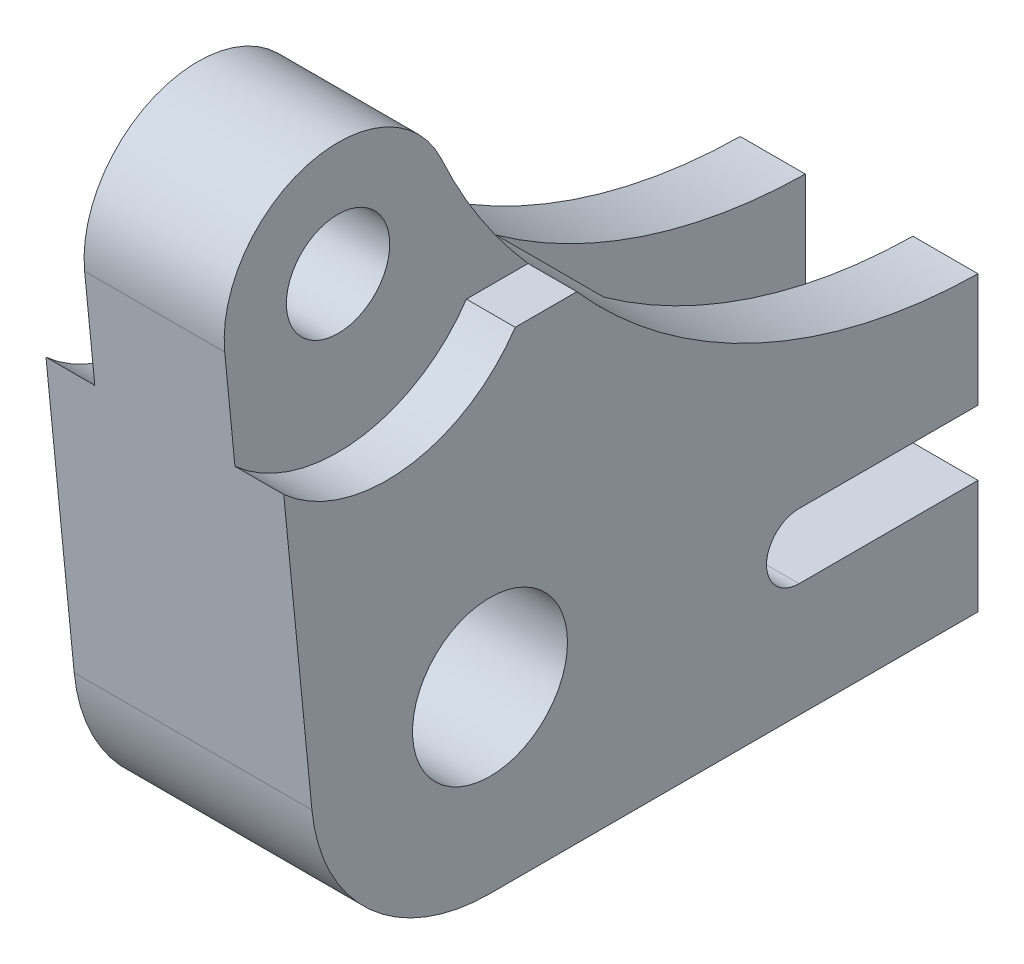
ISO-10303-21;
HEADER;
FILE_DESCRIPTION(('STEP AP214'),'2;1');
FILE_NAME('part.step','',(''),(''),'','','');
FILE_SCHEMA(('AUTOMOTIVE_DESIGN { 1 0 10303 214 1 1 1 1 }'));
ENDSEC;
DATA;
#1=APPLICATION_CONTEXT('core data for automotive mechanical design processes');
#2=APPLICATION_PROTOCOL_DEFINITION('international standard','automotive_design',2000,#1);
#3=PRODUCT_CONTEXT('',#1,'mechanical');
#4=PRODUCT('Part','Part','',(#3));
#5=PRODUCT_RELATED_PRODUCT_CATEGORY('part','',(#4));
#6=PRODUCT_DEFINITION_FORMATION('','',#4);
#7=PRODUCT_DEFINITION_CONTEXT('part definition',#1,'design');
#8=PRODUCT_DEFINITION('design','',#6,#7);
#9=PRODUCT_DEFINITION_SHAPE('','',#8);
#10=(LENGTH_UNIT() NAMED_UNIT(*) SI_UNIT(.MILLI.,.METRE.));
#11=(NAMED_UNIT(*) PLANE_ANGLE_UNIT() SI_UNIT($,.RADIAN.));
#12=(NAMED_UNIT(*) SI_UNIT($,.STERADIAN.) SOLID_ANGLE_UNIT());
#13=UNCERTAINTY_MEASURE_WITH_UNIT(LENGTH_MEASURE(1.E-05),#10,'distance_accuracy_value','');
#14=(GEOMETRIC_REPRESENTATION_CONTEXT(3) GLOBAL_UNCERTAINTY_ASSIGNED_CONTEXT((#13)) GLOBAL_UNIT_ASSIGNED_CONTEXT((#10,
#11,#12)) REPRESENTATION_CONTEXT('',''));
#15=CARTESIAN_POINT('',(0.,0.,0.));
#16=DIRECTION('',(0.,0.,1.));
#17=DIRECTION('',(1.,0.,0.));
#18=AXIS2_PLACEMENT_3D('',#15,#16,#17);
#19=CARTESIAN_POINT('',(14.615,47.3303654881643,12.6821332100236));
#20=DIRECTION('',(-1.,0.,0.));
#21=DIRECTION('',(0.,0.,1.));
#22=AXIS2_PLACEMENT_3D('',#19,#20,#21);
#23=CYLINDRICAL_SURFACE('',#22,14.);
#24=CARTESIAN_POINT('',(-8.615,47.3303654881643,12.6821332100236));
#25=DIRECTION('',(1.,0.,0.));
#26=DIRECTION('',(0.,0.,-1.));
#27=AXIS2_PLACEMENT_3D('',#24,#25,#26);
#28=CIRCLE('',#27,14.);
#29=CARTESIAN_POINT('',(-8.615,53.2602472106962,0.));
#30=VERTEX_POINT('',#29);
#31=CARTESIAN_POINT('',(-8.615,45.9633482628683,26.6152327900073));
#32=VERTEX_POINT('',#31);
#33=EDGE_CURVE('E222',#30,#32,#28,.T.);
#34=ORIENTED_EDGE('',*,*,#33,.T.);
#35=DIRECTION('',(-1.,0.,0.));
#36=VECTOR('',#35,1.);
#37=CARTESIAN_POINT('',(14.615,45.9633482628683,26.6152327900073));
#38=LINE('',#37,#36);
#39=CARTESIAN_POINT('',(8.615,45.9633482628683,26.6152327900073));
#40=VERTEX_POINT('',#39);
#41=EDGE_CURVE('E438',#40,#32,#38,.T.);
#42=ORIENTED_EDGE('',*,*,#41,.F.);
#43=CARTESIAN_POINT('',(8.615,47.3303654881643,12.6821332100236));
#44=DIRECTION('',(1.,0.,0.));
#45=DIRECTION('',(0.,0.,-1.));
#46=AXIS2_PLACEMENT_3D('',#43,#44,#45);
#47=CIRCLE('',#46,14.);
#48=CARTESIAN_POINT('',(8.615,53.2602472106962,0.));
#49=VERTEX_POINT('',#48);
#50=EDGE_CURVE('E70',#49,#40,#47,.T.);
#51=ORIENTED_EDGE('',*,*,#50,.F.);
#52=DIRECTION('',(-1.,0.,0.));
#53=VECTOR('',#52,1.);
#54=CARTESIAN_POINT('',(14.615,53.2602472106962,0.));
#55=LINE('',#54,#53);
#56=EDGE_CURVE('E442',#49,#30,#55,.T.);
#57=ORIENTED_EDGE('',*,*,#56,.T.);
#58=EDGE_LOOP('',(#34,#42,#51,#57));
#59=FACE_BOUND('',#58,.T.);
#60=ADVANCED_FACE('F45',(#59),#23,.T.);
#61=CARTESIAN_POINT('',(14.615,47.3303654881643,12.6821332100236));
#62=DIRECTION('',(-1.,0.,0.));
#63=DIRECTION('',(0.,0.,1.));
#64=AXIS2_PLACEMENT_3D('',#61,#62,#63);
#65=CYLINDRICAL_SURFACE('',#64,6.35);
#66=CARTESIAN_POINT('',(8.615,47.3303654881643,12.6821332100236));
#67=DIRECTION('',(1.,0.,0.));
#68=DIRECTION('',(0.,0.,-1.));
#69=AXIS2_PLACEMENT_3D('',#66,#67,#68);
#70=CIRCLE('',#69,6.35);
#71=CARTESIAN_POINT('',(8.615,47.3303654881643,6.33213321002356));
#72=VERTEX_POINT('',#71);
#73=EDGE_CURVE('E49',#72,#72,#70,.T.);
#74=ORIENTED_EDGE('',*,*,#73,.T.);
#75=EDGE_LOOP('',(#74));
#76=FACE_BOUND('',#75,.T.);
#77=CARTESIAN_POINT('',(-8.615,47.3303654881643,12.6821332100236));
#78=DIRECTION('',(-1.,0.,0.));
#79=DIRECTION('',(0.,0.,1.));
#80=AXIS2_PLACEMENT_3D('',#77,#78,#79);
#81=CIRCLE('',#80,6.35);
#82=CARTESIAN_POINT('',(-8.615,47.3303654881643,19.0321332100236));
#83=VERTEX_POINT('',#82);
#84=EDGE_CURVE('E242',#83,#83,#81,.T.);
#85=ORIENTED_EDGE('',*,*,#84,.T.);
#86=EDGE_LOOP('',(#85));
#87=FACE_BOUND('',#86,.T.);
#88=ADVANCED_FACE('F567',(#76,#87),#65,.F.);
#89=CARTESIAN_POINT('',(-14.615,80.9926693409927,-60.9910875684886));
#90=DIRECTION('',(-1.,0.,0.));
#91=DIRECTION('',(0.,0.,1.));
#92=AXIS2_PLACEMENT_3D('',#89,#90,#91);
#93=PLANE('',#92);
#94=CARTESIAN_POINT('',(-14.615,0.,0.));
#95=DIRECTION('',(1.,0.,0.));
#96=DIRECTION('',(0.,0.,-1.));
#97=AXIS2_PLACEMENT_3D('',#94,#95,#96);
#98=CIRCLE('',#97,9.525);
#99=CARTESIAN_POINT('',(-14.615,0.,-9.525));
#100=VERTEX_POINT('',#99);
#101=EDGE_CURVE('E362',#100,#100,#98,.T.);
#102=ORIENTED_EDGE('',*,*,#101,.T.);
#103=EDGE_LOOP('',(#102));
#104=FACE_BOUND('',#103,.T.);
#105=DIRECTION('',(0.,-0.995221398570269,-0.0976440875211449));
#106=VECTOR('',#105,1.);
#107=CARTESIAN_POINT('',(-14.615,45.9633482628683,26.6152327900073));
#108=LINE('',#107,#106);
#109=CARTESIAN_POINT('',(-14.615,33.1794979309688,25.3609717758667));
#110=VERTEX_POINT('',#109);
#111=CARTESIAN_POINT('',(-14.615,-2.14816992546519,21.8948707685459));
#112=VERTEX_POINT('',#111);
#113=EDGE_CURVE('E407',#110,#112,#108,.T.);
#114=ORIENTED_EDGE('',*,*,#113,.F.);
#115=CARTESIAN_POINT('',(-14.615,47.3303654881643,12.6821332100236));
#116=DIRECTION('',(1.,0.,0.));
#117=DIRECTION('',(0.,0.,-1.));
#118=AXIS2_PLACEMENT_3D('',#115,#116,#117);
#119=CIRCLE('',#118,19.);
#120=CARTESIAN_POINT('',(-14.615,36.7503654881643,-3.09961574248484));
#121=VERTEX_POINT('',#120);
#122=EDGE_CURVE('E227',#110,#121,#119,.T.);
#123=ORIENTED_EDGE('',*,*,#122,.T.);
#124=DIRECTION('',(0.,0.,-1.));
#125=VECTOR('',#124,1.);
#126=CARTESIAN_POINT('',(-14.615,36.7503654881643,-3.09961574248484));
#127=LINE('',#126,#125);
#128=CARTESIAN_POINT('',(-14.615,36.7503654881643,-10.675895530755));
#129=VERTEX_POINT('',#128);
#130=EDGE_CURVE('E474',#121,#129,#127,.T.);
#131=ORIENTED_EDGE('',*,*,#130,.T.);
#132=CARTESIAN_POINT('',(-14.615,80.9926693409927,-60.9910875684886));
#133=DIRECTION('',(-1.,0.,0.));
#134=DIRECTION('',(0.,0.,1.));
#135=AXIS2_PLACEMENT_3D('',#132,#133,#134);
#136=CIRCLE('',#135,67.);
#137=CARTESIAN_POINT('',(-14.615,14.,-60.));
#138=VERTEX_POINT('',#137);
#139=EDGE_CURVE('E231',#138,#129,#136,.T.);
#140=ORIENTED_EDGE('',*,*,#139,.F.);
#141=DIRECTION('',(0.,1.,0.));
#142=VECTOR('',#141,1.);
#143=CARTESIAN_POINT('',(-14.615,-22.,-60.));
#144=LINE('',#143,#142);
#145=CARTESIAN_POINT('',(-14.615,0.,-60.));
#146=VERTEX_POINT('',#145);
#147=EDGE_CURVE('E417',#146,#138,#144,.T.);
#148=ORIENTED_EDGE('',*,*,#147,.F.);
#149=DIRECTION('',(0.,0.,1.));
#150=VECTOR('',#149,1.);
#151=CARTESIAN_POINT('',(-14.615,0.,-38.));
#152=LINE('',#151,#150);
#153=CARTESIAN_POINT('',(-14.615,0.,-38.));
#154=VERTEX_POINT('',#153);
#155=EDGE_CURVE('E343',#146,#154,#152,.T.);
#156=ORIENTED_EDGE('',*,*,#155,.T.);
#157=CARTESIAN_POINT('',(-14.615,-4.,-38.));
#158=DIRECTION('',(1.,0.,0.));
#159=DIRECTION('',(0.,0.,-1.));
#160=AXIS2_PLACEMENT_3D('',#157,#158,#159);
#161=CIRCLE('',#160,4.);
#162=CARTESIAN_POINT('',(-14.615,-8.,-38.));
#163=VERTEX_POINT('',#162);
#164=EDGE_CURVE('E334',#154,#163,#161,.T.);
#165=ORIENTED_EDGE('',*,*,#164,.T.);
#166=DIRECTION('',(0.,0.,-1.));
#167=VECTOR('',#166,1.);
#168=CARTESIAN_POINT('',(-14.615,-8.,-38.));
#169=LINE('',#168,#167);
#170=CARTESIAN_POINT('',(-14.615,-8.,-60.));
#171=VERTEX_POINT('',#170);
#172=EDGE_CURVE('E338',#163,#171,#169,.T.);
#173=ORIENTED_EDGE('',*,*,#172,.T.);
#174=CARTESIAN_POINT('',(-14.615,-22.,-60.));
#175=VERTEX_POINT('',#174);
#176=EDGE_CURVE('E390',#175,#171,#144,.T.);
#177=ORIENTED_EDGE('',*,*,#176,.F.);
#178=DIRECTION('',(0.,0.,-1.));
#179=VECTOR('',#178,1.);
#180=CARTESIAN_POINT('',(-14.615,-22.,0.));
#181=LINE('',#180,#179);
#182=CARTESIAN_POINT('',(-14.615,-22.,0.));
#183=VERTEX_POINT('',#182);
#184=EDGE_CURVE('E413',#183,#175,#181,.T.);
#185=ORIENTED_EDGE('',*,*,#184,.F.);
#186=CARTESIAN_POINT('',(-14.615,0.,0.));
#187=DIRECTION('',(1.,0.,0.));
#188=DIRECTION('',(0.,0.,-1.));
#189=AXIS2_PLACEMENT_3D('',#186,#187,#188);
#190=CIRCLE('',#189,22.);
#191=EDGE_CURVE('E410',#112,#183,#190,.T.);
#192=ORIENTED_EDGE('',*,*,#191,.F.);
#193=EDGE_LOOP('',(#114,#123,#131,#140,#148,#156,#165,#173,#177,#185,#192));
#194=FACE_BOUND('',#193,.T.);
#195=ADVANCED_FACE('F543',(#104,#194),#93,.T.);
#196=CARTESIAN_POINT('',(14.615,80.9926693409927,-60.9910875684886));
#197=DIRECTION('',(-1.,0.,0.));
#198=DIRECTION('',(0.,0.,1.));
#199=AXIS2_PLACEMENT_3D('',#196,#197,#198);
#200=CYLINDRICAL_SURFACE('',#199,67.);
#201=DIRECTION('',(-1.,0.,0.));
#202=VECTOR('',#201,1.);
#203=CARTESIAN_POINT('',(-8.615,36.7503654881643,-10.675895530755));
#204=LINE('',#203,#202);
#205=CARTESIAN_POINT('',(-8.615,36.7503654881643,-10.675895530755));
#206=VERTEX_POINT('',#205);
#207=EDGE_CURVE('E213',#206,#129,#204,.T.);
#208=ORIENTED_EDGE('',*,*,#207,.F.);
#209=CARTESIAN_POINT('',(-8.615,80.9926693409927,-60.9910875684886));
#210=DIRECTION('',(-1.,0.,0.));
#211=DIRECTION('',(0.,0.,-1.));
#212=AXIS2_PLACEMENT_3D('',#209,#210,#211);
#213=CIRCLE('',#212,67.);
#214=EDGE_CURVE('E217',#206,#30,#213,.T.);
#215=ORIENTED_EDGE('',*,*,#214,.T.);
#216=ORIENTED_EDGE('',*,*,#56,.F.);
#217=CARTESIAN_POINT('',(8.615,80.9926693409927,-60.9910875684886));
#218=DIRECTION('',(-1.,0.,0.));
#219=DIRECTION('',(0.,0.,-1.));
#220=AXIS2_PLACEMENT_3D('',#217,#218,#219);
#221=CIRCLE('',#220,67.);
#222=CARTESIAN_POINT('',(8.615,36.7503654881643,-10.675895530755));
#223=VERTEX_POINT('',#222);
#224=EDGE_CURVE('E247',#223,#49,#221,.T.);
#225=ORIENTED_EDGE('',*,*,#224,.F.);
#226=DIRECTION('',(1.,0.,0.));
#227=VECTOR('',#226,1.);
#228=CARTESIAN_POINT('',(8.615,36.7503654881643,-10.675895530755));
#229=LINE('',#228,#227);
#230=CARTESIAN_POINT('',(14.615,36.7503654881643,-10.675895530755));
#231=VERTEX_POINT('',#230);
#232=EDGE_CURVE('E270',#223,#231,#229,.T.);
#233=ORIENTED_EDGE('',*,*,#232,.T.);
#234=CARTESIAN_POINT('',(14.615,80.9926693409927,-60.9910875684886));
#235=DIRECTION('',(-1.,0.,0.));
#236=DIRECTION('',(0.,0.,1.));
#237=AXIS2_PLACEMENT_3D('',#234,#235,#236);
#238=CIRCLE('',#237,67.);
#239=CARTESIAN_POINT('',(14.615,14.,-60.));
#240=VERTEX_POINT('',#239);
#241=EDGE_CURVE('E385',#240,#231,#238,.T.);
#242=ORIENTED_EDGE('',*,*,#241,.F.);
#243=DIRECTION('',(-1.,0.,0.));
#244=VECTOR('',#243,1.);
#245=CARTESIAN_POINT('',(14.615,14.,-60.));
#246=LINE('',#245,#244);
#247=CARTESIAN_POINT('',(6.61500000000001,14.,-60.));
#248=VERTEX_POINT('',#247);
#249=EDGE_CURVE('E421',#240,#248,#246,.T.);
#250=ORIENTED_EDGE('',*,*,#249,.T.);
#251=CARTESIAN_POINT('',(6.61500000000001,80.9926693409927,-60.9910875684886));
#252=DIRECTION('',(1.,0.,0.));
#253=DIRECTION('',(0.,0.,-1.));
#254=AXIS2_PLACEMENT_3D('',#251,#252,#253);
#255=CIRCLE('',#254,67.);
#256=CARTESIAN_POINT('',(6.615,26.5069364357041,-22.));
#257=VERTEX_POINT('',#256);
#258=EDGE_CURVE('E313',#248,#257,#255,.F.);
#259=ORIENTED_EDGE('',*,*,#258,.T.);
#260=DIRECTION('',(-1.,0.,0.));
#261=VECTOR('',#260,1.);
#262=CARTESIAN_POINT('',(14.615,26.5069364357041,-22.));
#263=LINE('',#262,#261);
#264=CARTESIAN_POINT('',(-6.61499999999999,26.5069364357041,-22.));
#265=VERTEX_POINT('',#264);
#266=EDGE_CURVE('E329',#257,#265,#263,.T.);
#267=ORIENTED_EDGE('',*,*,#266,.T.);
#268=CARTESIAN_POINT('',(-6.61499999999999,80.9926693409927,-60.9910875684886));
#269=DIRECTION('',(-1.,0.,0.));
#270=DIRECTION('',(0.,0.,1.));
#271=AXIS2_PLACEMENT_3D('',#268,#269,#270);
#272=CIRCLE('',#271,67.);
#273=CARTESIAN_POINT('',(-6.61499999999999,14.,-60.));
#274=VERTEX_POINT('',#273);
#275=EDGE_CURVE('E325',#265,#274,#272,.F.);
#276=ORIENTED_EDGE('',*,*,#275,.T.);
#277=EDGE_CURVE('E404',#274,#138,#246,.T.);
#278=ORIENTED_EDGE('',*,*,#277,.T.);
#279=ORIENTED_EDGE('',*,*,#139,.T.);
#280=EDGE_LOOP('',(#208,#215,#216,#225,#233,#242,#250,#259,#267,#276,#278,#279));
#281=FACE_BOUND('',#280,.T.);
#282=ADVANCED_FACE('F47',(#281),#200,.F.);
#283=CARTESIAN_POINT('',(14.615,45.9633482628683,26.6152327900073));
#284=DIRECTION('',(0.,0.0976440875211449,-0.995221398570269));
#285=DIRECTION('',(0.,0.995221398570269,0.097644087521145));
#286=AXIS2_PLACEMENT_3D('',#283,#284,#285);
#287=PLANE('',#286);
#288=DIRECTION('',(-1.,0.,0.));
#289=VECTOR('',#288,1.);
#290=CARTESIAN_POINT('',(-8.615,33.1794979309688,25.3609717758667));
#291=LINE('',#290,#289);
#292=CARTESIAN_POINT('',(-8.615,33.1794979309688,25.3609717758667));
#293=VERTEX_POINT('',#292);
#294=EDGE_CURVE('E236',#293,#110,#291,.T.);
#295=ORIENTED_EDGE('',*,*,#294,.T.);
#296=ORIENTED_EDGE('',*,*,#113,.T.);
#297=DIRECTION('',(-1.,0.,0.));
#298=VECTOR('',#297,1.);
#299=CARTESIAN_POINT('',(14.615,-2.14816992546519,21.8948707685459));
#300=LINE('',#299,#298);
#301=CARTESIAN_POINT('',(14.615,-2.14816992546519,21.8948707685459));
#302=VERTEX_POINT('',#301);
#303=EDGE_CURVE('E434',#302,#112,#300,.T.);
#304=ORIENTED_EDGE('',*,*,#303,.F.);
#305=DIRECTION('',(0.,-0.995221398570269,-0.0976440875211449));
#306=VECTOR('',#305,1.);
#307=CARTESIAN_POINT('',(14.615,45.9633482628683,26.6152327900073));
#308=LINE('',#307,#306);
#309=CARTESIAN_POINT('',(14.615,33.1794979309688,25.3609717758667));
#310=VERTEX_POINT('',#309);
#311=EDGE_CURVE('E389',#310,#302,#308,.T.);
#312=ORIENTED_EDGE('',*,*,#311,.F.);
#313=DIRECTION('',(1.,0.,0.));
#314=VECTOR('',#313,1.);
#315=CARTESIAN_POINT('',(8.615,33.1794979309688,25.3609717758667));
#316=LINE('',#315,#314);
#317=CARTESIAN_POINT('',(8.615,33.1794979309688,25.3609717758667));
#318=VERTEX_POINT('',#317);
#319=EDGE_CURVE('E264',#318,#310,#316,.T.);
#320=ORIENTED_EDGE('',*,*,#319,.F.);
#321=DIRECTION('',(0.,-0.995221398570269,-0.0976440875211446));
#322=VECTOR('',#321,1.);
#323=CARTESIAN_POINT('',(8.615,45.9633482628683,26.6152327900073));
#324=LINE('',#323,#322);
#325=EDGE_CURVE('E253',#40,#318,#324,.T.);
#326=ORIENTED_EDGE('',*,*,#325,.F.);
#327=ORIENTED_EDGE('',*,*,#41,.T.);
#328=DIRECTION('',(0.,-0.995221398570269,-0.0976440875211446));
#329=VECTOR('',#328,1.);
#330=CARTESIAN_POINT('',(-8.615,45.9633482628683,26.6152327900073));
#331=LINE('',#330,#329);
#332=EDGE_CURVE('E238',#32,#293,#331,.T.);
#333=ORIENTED_EDGE('',*,*,#332,.T.);
#334=EDGE_LOOP('',(#295,#296,#304,#312,#320,#326,#327,#333));
#335=FACE_BOUND('',#334,.T.);
#336=ADVANCED_FACE('F482',(#335),#287,.F.);
#337=CARTESIAN_POINT('',(14.615,-22.,-60.));
#338=DIRECTION('',(0.,0.,1.));
#339=DIRECTION('',(0.,-1.,0.));
#340=AXIS2_PLACEMENT_3D('',#337,#338,#339);
#341=PLANE('',#340);
#342=ORIENTED_EDGE('',*,*,#277,.F.);
#343=DIRECTION('',(0.,-1.,0.));
#344=VECTOR('',#343,1.);
#345=CARTESIAN_POINT('',(-6.61499999999999,61.3303654881643,-60.));
#346=LINE('',#345,#344);
#347=CARTESIAN_POINT('',(-6.61499999999999,0.,-60.));
#348=VERTEX_POINT('',#347);
#349=EDGE_CURVE('E302',#274,#348,#346,.T.);
#350=ORIENTED_EDGE('',*,*,#349,.T.);
#351=DIRECTION('',(1.,0.,0.));
#352=VECTOR('',#351,1.);
#353=CARTESIAN_POINT('',(-14.615,0.,-60.));
#354=LINE('',#353,#352);
#355=EDGE_CURVE('E364',#146,#348,#354,.T.);
#356=ORIENTED_EDGE('',*,*,#355,.F.);
#357=ORIENTED_EDGE('',*,*,#147,.T.);
#358=EDGE_LOOP('',(#342,#350,#356,#357));
#359=FACE_BOUND('',#358,.T.);
#360=ADVANCED_FACE('F530',(#359),#341,.F.);
#361=DIRECTION('',(1.,0.,0.));
#362=VECTOR('',#361,1.);
#363=CARTESIAN_POINT('',(-14.615,-8.,-60.));
#364=LINE('',#363,#362);
#365=CARTESIAN_POINT('',(-6.61499999999999,-7.99999999999997,-60.));
#366=VERTEX_POINT('',#365);
#367=EDGE_CURVE('E369',#171,#366,#364,.T.);
#368=ORIENTED_EDGE('',*,*,#367,.T.);
#369=CARTESIAN_POINT('',(-6.61499999999999,-22.,-60.));
#370=VERTEX_POINT('',#369);
#371=EDGE_CURVE('E290',#366,#370,#346,.T.);
#372=ORIENTED_EDGE('',*,*,#371,.T.);
#373=DIRECTION('',(-1.,0.,0.));
#374=VECTOR('',#373,1.);
#375=CARTESIAN_POINT('',(14.615,-22.,-60.));
#376=LINE('',#375,#374);
#377=EDGE_CURVE('E425',#370,#175,#376,.T.);
#378=ORIENTED_EDGE('',*,*,#377,.T.);
#379=ORIENTED_EDGE('',*,*,#176,.T.);
#380=EDGE_LOOP('',(#368,#372,#378,#379));
#381=FACE_BOUND('',#380,.T.);
#382=ADVANCED_FACE('F538',(#381),#341,.F.);
#383=CARTESIAN_POINT('',(-14.615,-4.,-38.));
#384=DIRECTION('',(1.,0.,0.));
#385=DIRECTION('',(0.,0.,-1.));
#386=AXIS2_PLACEMENT_3D('',#383,#384,#385);
#387=CYLINDRICAL_SURFACE('',#386,4.);
#388=DIRECTION('',(1.,0.,0.));
#389=VECTOR('',#388,1.);
#390=CARTESIAN_POINT('',(-14.615,0.,-38.));
#391=LINE('',#390,#389);
#392=CARTESIAN_POINT('',(-6.61499999999999,0.,-38.));
#393=VERTEX_POINT('',#392);
#394=EDGE_CURVE('E358',#154,#393,#391,.T.);
#395=ORIENTED_EDGE('',*,*,#394,.T.);
#396=CARTESIAN_POINT('',(-6.61499999999999,-4.,-38.));
#397=DIRECTION('',(-1.,0.,0.));
#398=DIRECTION('',(0.,0.,1.));
#399=AXIS2_PLACEMENT_3D('',#396,#397,#398);
#400=CIRCLE('',#399,4.);
#401=CARTESIAN_POINT('',(-6.61499999999999,-8.,-38.));
#402=VERTEX_POINT('',#401);
#403=EDGE_CURVE('E317',#393,#402,#400,.F.);
#404=ORIENTED_EDGE('',*,*,#403,.T.);
#405=DIRECTION('',(1.,0.,0.));
#406=VECTOR('',#405,1.);
#407=CARTESIAN_POINT('',(-14.615,-8.,-38.));
#408=LINE('',#407,#406);
#409=EDGE_CURVE('E374',#163,#402,#408,.T.);
#410=ORIENTED_EDGE('',*,*,#409,.F.);
#411=ORIENTED_EDGE('',*,*,#164,.F.);
#412=EDGE_LOOP('',(#395,#404,#410,#411));
#413=FACE_BOUND('',#412,.T.);
#414=ADVANCED_FACE('F550',(#413),#387,.F.);
#415=CARTESIAN_POINT('',(-14.615,0.,-38.));
#416=DIRECTION('',(0.,1.,0.));
#417=DIRECTION('',(0.,0.,1.));
#418=AXIS2_PLACEMENT_3D('',#415,#416,#417);
#419=PLANE('',#418);
#420=ORIENTED_EDGE('',*,*,#355,.T.);
#421=DIRECTION('',(0.,0.,1.));
#422=VECTOR('',#421,1.);
#423=CARTESIAN_POINT('',(-6.61499999999999,0.,-38.));
#424=LINE('',#423,#422);
#425=EDGE_CURVE('E321',#348,#393,#424,.T.);
#426=ORIENTED_EDGE('',*,*,#425,.T.);
#427=ORIENTED_EDGE('',*,*,#394,.F.);
#428=ORIENTED_EDGE('',*,*,#155,.F.);
#429=EDGE_LOOP('',(#420,#426,#427,#428));
#430=FACE_BOUND('',#429,.T.);
#431=ADVANCED_FACE('F552',(#430),#419,.F.);
#432=CARTESIAN_POINT('',(-14.615,-8.,-38.));
#433=DIRECTION('',(0.,-1.,0.));
#434=DIRECTION('',(0.,0.,-1.));
#435=AXIS2_PLACEMENT_3D('',#432,#433,#434);
#436=PLANE('',#435);
#437=ORIENTED_EDGE('',*,*,#409,.T.);
#438=DIRECTION('',(0.,0.,-1.));
#439=VECTOR('',#438,1.);
#440=CARTESIAN_POINT('',(-6.61499999999999,-8.,-38.));
#441=LINE('',#440,#439);
#442=EDGE_CURVE('E11',#402,#366,#441,.T.);
#443=ORIENTED_EDGE('',*,*,#442,.T.);
#444=ORIENTED_EDGE('',*,*,#367,.F.);
#445=ORIENTED_EDGE('',*,*,#172,.F.);
#446=EDGE_LOOP('',(#437,#443,#444,#445));
#447=FACE_BOUND('',#446,.T.);
#448=ADVANCED_FACE('F547',(#447),#436,.F.);
#449=CARTESIAN_POINT('',(6.61500000000001,0.,-60.));
#450=VERTEX_POINT('',#449);
#451=CARTESIAN_POINT('',(14.615,0.,-60.));
#452=VERTEX_POINT('',#451);
#453=EDGE_CURVE('E368',#450,#452,#354,.T.);
#454=ORIENTED_EDGE('',*,*,#453,.F.);
#455=DIRECTION('',(0.,-1.,0.));
#456=VECTOR('',#455,1.);
#457=CARTESIAN_POINT('',(6.61500000000001,61.3303654881643,-60.));
#458=LINE('',#457,#456);
#459=EDGE_CURVE('E298',#248,#450,#458,.T.);
#460=ORIENTED_EDGE('',*,*,#459,.F.);
#461=ORIENTED_EDGE('',*,*,#249,.F.);
#462=DIRECTION('',(0.,1.,0.));
#463=VECTOR('',#462,1.);
#464=CARTESIAN_POINT('',(14.615,-22.,-60.));
#465=LINE('',#464,#463);
#466=EDGE_CURVE('E399',#452,#240,#465,.T.);
#467=ORIENTED_EDGE('',*,*,#466,.F.);
#468=EDGE_LOOP('',(#454,#460,#461,#467));
#469=FACE_BOUND('',#468,.T.);
#470=ADVANCED_FACE('F503',(#469),#341,.F.);
#471=CARTESIAN_POINT('',(14.615,80.9926693409927,-60.9910875684886));
#472=DIRECTION('',(-1.,0.,0.));
#473=DIRECTION('',(0.,0.,1.));
#474=AXIS2_PLACEMENT_3D('',#471,#472,#473);
#475=PLANE('',#474);
#476=ORIENTED_EDGE('',*,*,#241,.T.);
#477=DIRECTION('',(0.,0.,-1.));
#478=VECTOR('',#477,1.);
#479=CARTESIAN_POINT('',(14.615,36.7503654881643,-3.09961574248484));
#480=LINE('',#479,#478);
#481=CARTESIAN_POINT('',(14.615,36.7503654881643,-3.09961574248484));
#482=VERTEX_POINT('',#481);
#483=EDGE_CURVE('E250',#482,#231,#480,.T.);
#484=ORIENTED_EDGE('',*,*,#483,.F.);
#485=CARTESIAN_POINT('',(14.615,47.3303654881643,12.6821332100236));
#486=DIRECTION('',(1.,0.,0.));
#487=DIRECTION('',(0.,0.,-1.));
#488=AXIS2_PLACEMENT_3D('',#485,#486,#487);
#489=CIRCLE('',#488,19.);
#490=EDGE_CURVE('E246',#310,#482,#489,.T.);
#491=ORIENTED_EDGE('',*,*,#490,.F.);
#492=ORIENTED_EDGE('',*,*,#311,.T.);
#493=CARTESIAN_POINT('',(14.615,0.,0.));
#494=DIRECTION('',(1.,0.,0.));
#495=DIRECTION('',(0.,0.,-1.));
#496=AXIS2_PLACEMENT_3D('',#493,#494,#495);
#497=CIRCLE('',#496,22.);
#498=CARTESIAN_POINT('',(14.615,-22.,0.));
#499=VERTEX_POINT('',#498);
#500=EDGE_CURVE('E393',#302,#499,#497,.T.);
#501=ORIENTED_EDGE('',*,*,#500,.T.);
#502=DIRECTION('',(0.,0.,-1.));
#503=VECTOR('',#502,1.);
#504=CARTESIAN_POINT('',(14.615,-22.,0.));
#505=LINE('',#504,#503);
#506=CARTESIAN_POINT('',(14.615,-22.,-60.));
#507=VERTEX_POINT('',#506);
#508=EDGE_CURVE('E396',#499,#507,#505,.T.);
#509=ORIENTED_EDGE('',*,*,#508,.T.);
#510=CARTESIAN_POINT('',(14.615,-8.,-60.));
#511=VERTEX_POINT('',#510);
#512=EDGE_CURVE('E400',#507,#511,#465,.T.);
#513=ORIENTED_EDGE('',*,*,#512,.T.);
#514=DIRECTION('',(0.,0.,-1.));
#515=VECTOR('',#514,1.);
#516=CARTESIAN_POINT('',(14.615,-8.,-38.));
#517=LINE('',#516,#515);
#518=CARTESIAN_POINT('',(14.615,-8.,-38.));
#519=VERTEX_POINT('',#518);
#520=EDGE_CURVE('E351',#519,#511,#517,.T.);
#521=ORIENTED_EDGE('',*,*,#520,.F.);
#522=CARTESIAN_POINT('',(14.615,-4.,-38.));
#523=DIRECTION('',(1.,0.,0.));
#524=DIRECTION('',(0.,0.,-1.));
#525=AXIS2_PLACEMENT_3D('',#522,#523,#524);
#526=CIRCLE('',#525,4.);
#527=CARTESIAN_POINT('',(14.615,0.,-38.));
#528=VERTEX_POINT('',#527);
#529=EDGE_CURVE('E333',#528,#519,#526,.T.);
#530=ORIENTED_EDGE('',*,*,#529,.F.);
#531=DIRECTION('',(0.,0.,1.));
#532=VECTOR('',#531,1.);
#533=CARTESIAN_POINT('',(14.615,0.,-38.));
#534=LINE('',#533,#532);
#535=EDGE_CURVE('E339',#452,#528,#534,.T.);
#536=ORIENTED_EDGE('',*,*,#535,.F.);
#537=ORIENTED_EDGE('',*,*,#466,.T.);
#538=EDGE_LOOP('',(#476,#484,#491,#492,#501,#509,#513,#521,#530,#536,#537));
#539=FACE_BOUND('',#538,.T.);
#540=CARTESIAN_POINT('',(14.615,0.,0.));
#541=DIRECTION('',(1.,0.,0.));
#542=DIRECTION('',(0.,0.,-1.));
#543=AXIS2_PLACEMENT_3D('',#540,#541,#542);
#544=CIRCLE('',#543,9.525);
#545=CARTESIAN_POINT('',(14.615,0.,-9.525));
#546=VERTEX_POINT('',#545);
#547=EDGE_CURVE('E378',#546,#546,#544,.T.);
#548=ORIENTED_EDGE('',*,*,#547,.F.);
#549=EDGE_LOOP('',(#548));
#550=FACE_BOUND('',#549,.T.);
#551=ADVANCED_FACE('F494',(#539,#550),#475,.F.);
#552=CARTESIAN_POINT('',(14.615,0.,0.));
#553=DIRECTION('',(-1.,0.,0.));
#554=DIRECTION('',(0.,0.,1.));
#555=AXIS2_PLACEMENT_3D('',#552,#553,#554);
#556=CYLINDRICAL_SURFACE('',#555,22.);
#557=ORIENTED_EDGE('',*,*,#191,.T.);
#558=DIRECTION('',(-1.,0.,0.));
#559=VECTOR('',#558,1.);
#560=CARTESIAN_POINT('',(14.615,-22.,0.));
#561=LINE('',#560,#559);
#562=EDGE_CURVE('E430',#499,#183,#561,.T.);
#563=ORIENTED_EDGE('',*,*,#562,.F.);
#564=ORIENTED_EDGE('',*,*,#500,.F.);
#565=ORIENTED_EDGE('',*,*,#303,.T.);
#566=EDGE_LOOP('',(#557,#563,#564,#565));
#567=FACE_BOUND('',#566,.T.);
#568=ADVANCED_FACE('F555',(#567),#556,.T.);
#569=CARTESIAN_POINT('',(14.615,-22.,0.));
#570=DIRECTION('',(0.,1.,0.));
#571=DIRECTION('',(0.,0.,1.));
#572=AXIS2_PLACEMENT_3D('',#569,#570,#571);
#573=PLANE('',#572);
#574=ORIENTED_EDGE('',*,*,#377,.F.);
#575=DIRECTION('',(0.,0.,-1.));
#576=VECTOR('',#575,1.);
#577=CARTESIAN_POINT('',(-6.61499999999999,-22.,-60.));
#578=LINE('',#577,#576);
#579=CARTESIAN_POINT('',(-6.61499999999999,-22.,-22.));
#580=VERTEX_POINT('',#579);
#581=EDGE_CURVE('E279',#580,#370,#578,.T.);
#582=ORIENTED_EDGE('',*,*,#581,.F.);
#583=DIRECTION('',(-1.,0.,0.));
#584=VECTOR('',#583,1.);
#585=CARTESIAN_POINT('',(-6.61499999999999,-22.,-22.));
#586=LINE('',#585,#584);
#587=CARTESIAN_POINT('',(6.615,-22.,-22.));
#588=VERTEX_POINT('',#587);
#589=EDGE_CURVE('E286',#588,#580,#586,.T.);
#590=ORIENTED_EDGE('',*,*,#589,.F.);
#591=DIRECTION('',(0.,0.,1.));
#592=VECTOR('',#591,1.);
#593=CARTESIAN_POINT('',(6.61500000000001,-22.,-60.));
#594=LINE('',#593,#592);
#595=CARTESIAN_POINT('',(6.61500000000001,-22.,-60.));
#596=VERTEX_POINT('',#595);
#597=EDGE_CURVE('E282',#596,#588,#594,.T.);
#598=ORIENTED_EDGE('',*,*,#597,.F.);
#599=EDGE_CURVE('E426',#507,#596,#376,.T.);
#600=ORIENTED_EDGE('',*,*,#599,.F.);
#601=ORIENTED_EDGE('',*,*,#508,.F.);
#602=ORIENTED_EDGE('',*,*,#562,.T.);
#603=ORIENTED_EDGE('',*,*,#184,.T.);
#604=EDGE_LOOP('',(#574,#582,#590,#598,#600,#601,#602,#603));
#605=FACE_BOUND('',#604,.T.);
#606=ADVANCED_FACE('F520',(#605),#573,.F.);
#607=ORIENTED_EDGE('',*,*,#599,.T.);
#608=CARTESIAN_POINT('',(6.61500000000001,-7.99999999999997,-60.));
#609=VERTEX_POINT('',#608);
#610=EDGE_CURVE('E299',#609,#596,#458,.T.);
#611=ORIENTED_EDGE('',*,*,#610,.F.);
#612=EDGE_CURVE('E373',#609,#511,#364,.T.);
#613=ORIENTED_EDGE('',*,*,#612,.T.);
#614=ORIENTED_EDGE('',*,*,#512,.F.);
#615=EDGE_LOOP('',(#607,#611,#613,#614));
#616=FACE_BOUND('',#615,.T.);
#617=ADVANCED_FACE('F512',(#616),#341,.F.);
#618=CARTESIAN_POINT('',(14.615,0.,0.));
#619=DIRECTION('',(-1.,0.,0.));
#620=DIRECTION('',(0.,0.,1.));
#621=AXIS2_PLACEMENT_3D('',#618,#619,#620);
#622=CYLINDRICAL_SURFACE('',#621,9.525);
#623=ORIENTED_EDGE('',*,*,#547,.T.);
#624=EDGE_LOOP('',(#623));
#625=FACE_BOUND('',#624,.T.);
#626=ORIENTED_EDGE('',*,*,#101,.F.);
#627=EDGE_LOOP('',(#626));
#628=FACE_BOUND('',#627,.T.);
#629=ADVANCED_FACE('F590',(#625,#628),#622,.F.);
#630=CARTESIAN_POINT('',(6.61500000000001,-8.,-38.));
#631=VERTEX_POINT('',#630);
#632=EDGE_CURVE('E347',#631,#519,#408,.T.);
#633=ORIENTED_EDGE('',*,*,#632,.F.);
#634=CARTESIAN_POINT('',(6.615,-4.,-38.));
#635=DIRECTION('',(1.,0.,0.));
#636=DIRECTION('',(0.,0.,-1.));
#637=AXIS2_PLACEMENT_3D('',#634,#635,#636);
#638=CIRCLE('',#637,4.);
#639=CARTESIAN_POINT('',(6.615,0.,-38.));
#640=VERTEX_POINT('',#639);
#641=EDGE_CURVE('E294',#631,#640,#638,.F.);
#642=ORIENTED_EDGE('',*,*,#641,.T.);
#643=EDGE_CURVE('E363',#640,#528,#391,.T.);
#644=ORIENTED_EDGE('',*,*,#643,.T.);
#645=ORIENTED_EDGE('',*,*,#529,.T.);
#646=EDGE_LOOP('',(#633,#642,#644,#645));
#647=FACE_BOUND('',#646,.T.);
#648=ADVANCED_FACE('F454',(#647),#387,.F.);
#649=ORIENTED_EDGE('',*,*,#643,.F.);
#650=DIRECTION('',(0.,0.,-1.));
#651=VECTOR('',#650,1.);
#652=CARTESIAN_POINT('',(6.615,0.,-38.));
#653=LINE('',#652,#651);
#654=EDGE_CURVE('E309',#640,#450,#653,.T.);
#655=ORIENTED_EDGE('',*,*,#654,.T.);
#656=ORIENTED_EDGE('',*,*,#453,.T.);
#657=ORIENTED_EDGE('',*,*,#535,.T.);
#658=EDGE_LOOP('',(#649,#655,#656,#657));
#659=FACE_BOUND('',#658,.T.);
#660=ADVANCED_FACE('F507',(#659),#419,.F.);
#661=ORIENTED_EDGE('',*,*,#612,.F.);
#662=DIRECTION('',(0.,0.,1.));
#663=VECTOR('',#662,1.);
#664=CARTESIAN_POINT('',(6.615,-8.,-38.));
#665=LINE('',#664,#663);
#666=EDGE_CURVE('E55',#609,#631,#665,.T.);
#667=ORIENTED_EDGE('',*,*,#666,.T.);
#668=ORIENTED_EDGE('',*,*,#632,.T.);
#669=ORIENTED_EDGE('',*,*,#520,.T.);
#670=EDGE_LOOP('',(#661,#667,#668,#669));
#671=FACE_BOUND('',#670,.T.);
#672=ADVANCED_FACE('F450',(#671),#436,.F.);
#673=CARTESIAN_POINT('',(-6.61499999999999,61.3303654881643,-22.));
#674=DIRECTION('',(0.,0.,1.));
#675=DIRECTION('',(1.,0.,0.));
#676=AXIS2_PLACEMENT_3D('',#673,#674,#675);
#677=PLANE('',#676);
#678=DIRECTION('',(0.,-1.,0.));
#679=VECTOR('',#678,1.);
#680=CARTESIAN_POINT('',(6.615,61.3303654881643,-22.));
#681=LINE('',#680,#679);
#682=EDGE_CURVE('E295',#257,#588,#681,.T.);
#683=ORIENTED_EDGE('',*,*,#682,.T.);
#684=ORIENTED_EDGE('',*,*,#589,.T.);
#685=DIRECTION('',(0.,-1.,0.));
#686=VECTOR('',#685,1.);
#687=CARTESIAN_POINT('',(-6.61499999999999,61.3303654881643,-22.));
#688=LINE('',#687,#686);
#689=EDGE_CURVE('E291',#265,#580,#688,.T.);
#690=ORIENTED_EDGE('',*,*,#689,.F.);
#691=ORIENTED_EDGE('',*,*,#266,.F.);
#692=EDGE_LOOP('',(#683,#684,#690,#691));
#693=FACE_BOUND('',#692,.T.);
#694=ADVANCED_FACE('F524',(#693),#677,.F.);
#695=CARTESIAN_POINT('',(-6.61499999999999,61.3303654881643,-60.));
#696=DIRECTION('',(-1.,0.,0.));
#697=DIRECTION('',(0.,0.,1.));
#698=AXIS2_PLACEMENT_3D('',#695,#696,#697);
#699=PLANE('',#698);
#700=ORIENTED_EDGE('',*,*,#689,.T.);
#701=ORIENTED_EDGE('',*,*,#581,.T.);
#702=ORIENTED_EDGE('',*,*,#371,.F.);
#703=ORIENTED_EDGE('',*,*,#442,.F.);
#704=ORIENTED_EDGE('',*,*,#403,.F.);
#705=ORIENTED_EDGE('',*,*,#425,.F.);
#706=ORIENTED_EDGE('',*,*,#349,.F.);
#707=ORIENTED_EDGE('',*,*,#275,.F.);
#708=EDGE_LOOP('',(#700,#701,#702,#703,#704,#705,#706,#707));
#709=FACE_BOUND('',#708,.T.);
#710=ADVANCED_FACE('F548',(#709),#699,.F.);
#711=CARTESIAN_POINT('',(6.61500000000001,61.3303654881643,-60.));
#712=DIRECTION('',(1.,0.,0.));
#713=DIRECTION('',(0.,0.,-1.));
#714=AXIS2_PLACEMENT_3D('',#711,#712,#713);
#715=PLANE('',#714);
#716=ORIENTED_EDGE('',*,*,#459,.T.);
#717=ORIENTED_EDGE('',*,*,#654,.F.);
#718=ORIENTED_EDGE('',*,*,#641,.F.);
#719=ORIENTED_EDGE('',*,*,#666,.F.);
#720=ORIENTED_EDGE('',*,*,#610,.T.);
#721=ORIENTED_EDGE('',*,*,#597,.T.);
#722=ORIENTED_EDGE('',*,*,#682,.F.);
#723=ORIENTED_EDGE('',*,*,#258,.F.);
#724=EDGE_LOOP('',(#716,#717,#718,#719,#720,#721,#722,#723));
#725=FACE_BOUND('',#724,.T.);
#726=ADVANCED_FACE('F504',(#725),#715,.F.);
#727=CARTESIAN_POINT('',(8.615,36.7503654881643,-3.09961574248484));
#728=DIRECTION('',(0.,-1.,0.));
#729=DIRECTION('',(0.,0.,-1.));
#730=AXIS2_PLACEMENT_3D('',#727,#728,#729);
#731=PLANE('',#730);
#732=ORIENTED_EDGE('',*,*,#483,.T.);
#733=ORIENTED_EDGE('',*,*,#232,.F.);
#734=DIRECTION('',(0.,0.,-1.));
#735=VECTOR('',#734,1.);
#736=CARTESIAN_POINT('',(8.615,36.7503654881643,-3.09961574248484));
#737=LINE('',#736,#735);
#738=CARTESIAN_POINT('',(8.615,36.7503654881643,-3.09961574248484));
#739=VERTEX_POINT('',#738);
#740=EDGE_CURVE('E260',#739,#223,#737,.T.);
#741=ORIENTED_EDGE('',*,*,#740,.F.);
#742=DIRECTION('',(1.,0.,0.));
#743=VECTOR('',#742,1.);
#744=CARTESIAN_POINT('',(8.615,36.7503654881643,-3.09961574248484));
#745=LINE('',#744,#743);
#746=EDGE_CURVE('E274',#739,#482,#745,.T.);
#747=ORIENTED_EDGE('',*,*,#746,.T.);
#748=EDGE_LOOP('',(#732,#733,#741,#747));
#749=FACE_BOUND('',#748,.T.);
#750=ADVANCED_FACE('F490',(#749),#731,.F.);
#751=CARTESIAN_POINT('',(8.615,47.3303654881643,12.6821332100236));
#752=DIRECTION('',(1.,0.,0.));
#753=DIRECTION('',(0.,0.,-1.));
#754=AXIS2_PLACEMENT_3D('',#751,#752,#753);
#755=CYLINDRICAL_SURFACE('',#754,19.);
#756=ORIENTED_EDGE('',*,*,#490,.T.);
#757=ORIENTED_EDGE('',*,*,#746,.F.);
#758=CARTESIAN_POINT('',(8.615,47.3303654881643,12.6821332100236));
#759=DIRECTION('',(1.,0.,0.));
#760=DIRECTION('',(0.,0.,-1.));
#761=AXIS2_PLACEMENT_3D('',#758,#759,#760);
#762=CIRCLE('',#761,19.);
#763=EDGE_CURVE('E256',#318,#739,#762,.T.);
#764=ORIENTED_EDGE('',*,*,#763,.F.);
#765=ORIENTED_EDGE('',*,*,#319,.T.);
#766=EDGE_LOOP('',(#756,#757,#764,#765));
#767=FACE_BOUND('',#766,.T.);
#768=ADVANCED_FACE('F622',(#767),#755,.F.);
#769=CARTESIAN_POINT('',(8.615,80.9926693409927,-60.9910875684886));
#770=DIRECTION('',(1.,0.,0.));
#771=DIRECTION('',(0.,0.,-1.));
#772=AXIS2_PLACEMENT_3D('',#769,#770,#771);
#773=PLANE('',#772);
#774=ORIENTED_EDGE('',*,*,#73,.F.);
#775=EDGE_LOOP('',(#774));
#776=FACE_BOUND('',#775,.T.);
#777=ORIENTED_EDGE('',*,*,#224,.T.);
#778=ORIENTED_EDGE('',*,*,#50,.T.);
#779=ORIENTED_EDGE('',*,*,#325,.T.);
#780=ORIENTED_EDGE('',*,*,#763,.T.);
#781=ORIENTED_EDGE('',*,*,#740,.T.);
#782=EDGE_LOOP('',(#777,#778,#779,#780,#781));
#783=FACE_BOUND('',#782,.T.);
#784=ADVANCED_FACE('F487',(#776,#783),#773,.T.);
#785=CARTESIAN_POINT('',(-8.615,47.3303654881643,12.6821332100236));
#786=DIRECTION('',(-1.,0.,0.));
#787=DIRECTION('',(0.,0.,1.));
#788=AXIS2_PLACEMENT_3D('',#785,#786,#787);
#789=CYLINDRICAL_SURFACE('',#788,19.);
#790=ORIENTED_EDGE('',*,*,#122,.F.);
#791=ORIENTED_EDGE('',*,*,#294,.F.);
#792=CARTESIAN_POINT('',(-8.615,47.3303654881643,12.6821332100236));
#793=DIRECTION('',(1.,0.,0.));
#794=DIRECTION('',(0.,0.,-1.));
#795=AXIS2_PLACEMENT_3D('',#792,#793,#794);
#796=CIRCLE('',#795,19.);
#797=CARTESIAN_POINT('',(-8.615,36.7503654881643,-3.09961574248484));
#798=VERTEX_POINT('',#797);
#799=EDGE_CURVE('E62',#293,#798,#796,.T.);
#800=ORIENTED_EDGE('',*,*,#799,.T.);
#801=DIRECTION('',(-1.,0.,0.));
#802=VECTOR('',#801,1.);
#803=CARTESIAN_POINT('',(-8.615,36.7503654881643,-3.09961574248484));
#804=LINE('',#803,#802);
#805=EDGE_CURVE('E215',#798,#121,#804,.T.);
#806=ORIENTED_EDGE('',*,*,#805,.T.);
#807=EDGE_LOOP('',(#790,#791,#800,#806));
#808=FACE_BOUND('',#807,.T.);
#809=ADVANCED_FACE('F481',(#808),#789,.F.);
#810=CARTESIAN_POINT('',(-8.615,36.7503654881643,-3.09961574248484));
#811=DIRECTION('',(0.,1.,0.));
#812=DIRECTION('',(0.,0.,1.));
#813=AXIS2_PLACEMENT_3D('',#810,#811,#812);
#814=PLANE('',#813);
#815=ORIENTED_EDGE('',*,*,#130,.F.);
#816=ORIENTED_EDGE('',*,*,#805,.F.);
#817=DIRECTION('',(0.,0.,-1.));
#818=VECTOR('',#817,1.);
#819=CARTESIAN_POINT('',(-8.615,36.7503654881643,-3.09961574248484));
#820=LINE('',#819,#818);
#821=EDGE_CURVE('E208',#798,#206,#820,.T.);
#822=ORIENTED_EDGE('',*,*,#821,.T.);
#823=ORIENTED_EDGE('',*,*,#207,.T.);
#824=EDGE_LOOP('',(#815,#816,#822,#823));
#825=FACE_BOUND('',#824,.T.);
#826=ADVANCED_FACE('F211',(#825),#814,.T.);
#827=CARTESIAN_POINT('',(-8.615,80.9926693409927,-60.9910875684886));
#828=DIRECTION('',(-1.,0.,0.));
#829=DIRECTION('',(0.,0.,-1.));
#830=AXIS2_PLACEMENT_3D('',#827,#828,#829);
#831=PLANE('',#830);
#832=ORIENTED_EDGE('',*,*,#84,.F.);
#833=EDGE_LOOP('',(#832));
#834=FACE_BOUND('',#833,.T.);
#835=ORIENTED_EDGE('',*,*,#214,.F.);
#836=ORIENTED_EDGE('',*,*,#821,.F.);
#837=ORIENTED_EDGE('',*,*,#799,.F.);
#838=ORIENTED_EDGE('',*,*,#332,.F.);
#839=ORIENTED_EDGE('',*,*,#33,.F.);
#840=EDGE_LOOP('',(#835,#836,#837,#838,#839));
#841=FACE_BOUND('',#840,.T.);
#842=ADVANCED_FACE('F220',(#834,#841),#831,.T.);
#843=CLOSED_SHELL('',(#60,#88,#195,#282,#336,#360,#382,#414,#431,#448,#470,#551,#568,#606,#617,
#629,#648,#660,#672,#694,#710,#726,#750,#768,#784,#809,#826,#842));
#844=MANIFOLD_SOLID_BREP('B2',#843);
#845=ADVANCED_BREP_SHAPE_REPRESENTATION('',(#18,#844),#14);
#846=SHAPE_DEFINITION_REPRESENTATION(#9,#845);
ENDSEC;
END-ISO-10303-21;
